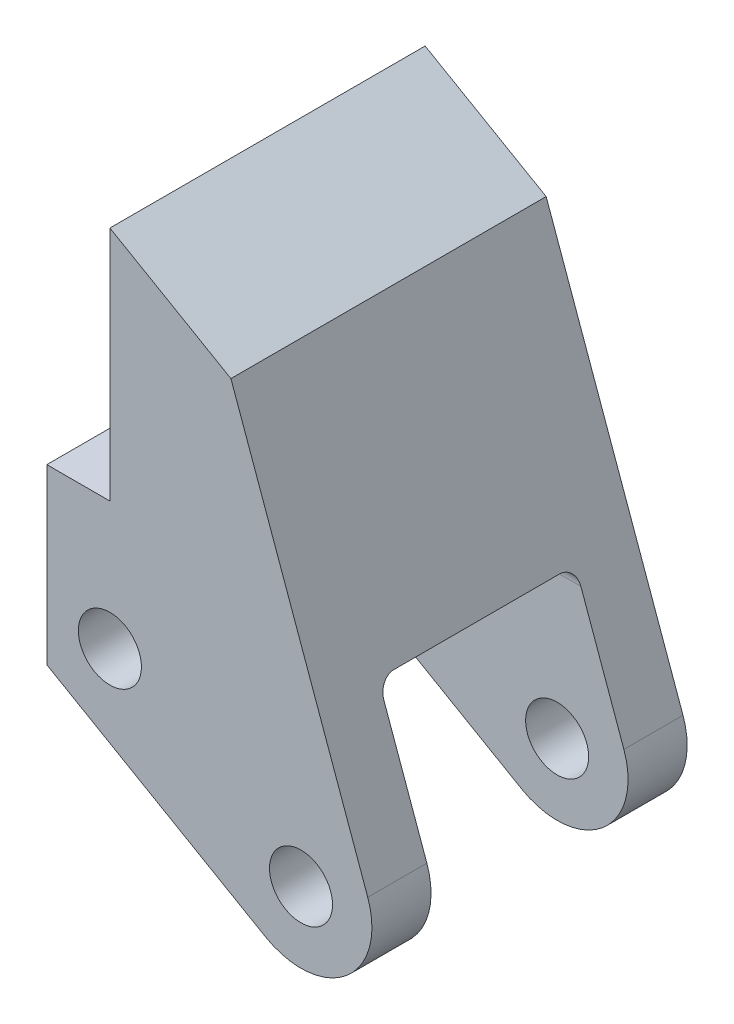
ISO-10303-21;
HEADER;
FILE_DESCRIPTION(('STEP AP214'),'2;1');
FILE_NAME('part.step','',(''),(''),'','','');
FILE_SCHEMA(('AUTOMOTIVE_DESIGN { 1 0 10303 214 1 1 1 1 }'));
ENDSEC;
DATA;
#1=APPLICATION_CONTEXT('core data for automotive mechanical design processes');
#2=APPLICATION_PROTOCOL_DEFINITION('international standard','automotive_design',2000,#1);
#3=PRODUCT_CONTEXT('',#1,'mechanical');
#4=PRODUCT('Part','Part','',(#3));
#5=PRODUCT_RELATED_PRODUCT_CATEGORY('part','',(#4));
#6=PRODUCT_DEFINITION_FORMATION('','',#4);
#7=PRODUCT_DEFINITION_CONTEXT('part definition',#1,'design');
#8=PRODUCT_DEFINITION('design','',#6,#7);
#9=PRODUCT_DEFINITION_SHAPE('','',#8);
#10=(LENGTH_UNIT() NAMED_UNIT(*) SI_UNIT(.MILLI.,.METRE.));
#11=(NAMED_UNIT(*) PLANE_ANGLE_UNIT() SI_UNIT($,.RADIAN.));
#12=(NAMED_UNIT(*) SI_UNIT($,.STERADIAN.) SOLID_ANGLE_UNIT());
#13=UNCERTAINTY_MEASURE_WITH_UNIT(LENGTH_MEASURE(1.E-05),#10,'distance_accuracy_value','');
#14=(GEOMETRIC_REPRESENTATION_CONTEXT(3) GLOBAL_UNCERTAINTY_ASSIGNED_CONTEXT((#13)) GLOBAL_UNIT_ASSIGNED_CONTEXT((#10,
#11,#12)) REPRESENTATION_CONTEXT('',''));
#15=CARTESIAN_POINT('',(0.,0.,0.));
#16=DIRECTION('',(0.,0.,1.));
#17=DIRECTION('',(1.,0.,0.));
#18=AXIS2_PLACEMENT_3D('',#15,#16,#17);
#19=CARTESIAN_POINT('',(-7.99999999999999,-5.77350269189626,40.));
#20=DIRECTION('',(0.500000000000001,0.866025403784438,0.));
#21=DIRECTION('',(-0.866025403784438,0.500000000000001,0.));
#22=AXIS2_PLACEMENT_3D('',#19,#20,#21);
#23=PLANE('',#22);
#24=DIRECTION('',(0.,0.,-1.));
#25=VECTOR('',#24,1.);
#26=CARTESIAN_POINT('',(19.7487113059643,-21.79422863406,40.));
#27=LINE('',#26,#25);
#28=CARTESIAN_POINT('',(19.7487113059643,-21.79422863406,7.5));
#29=VERTEX_POINT('',#28);
#30=CARTESIAN_POINT('',(19.7487113059643,-21.79422863406,0.));
#31=VERTEX_POINT('',#30);
#32=EDGE_CURVE('E256',#29,#31,#27,.T.);
#33=ORIENTED_EDGE('',*,*,#32,.F.);
#34=DIRECTION('',(-0.866025403784438,0.500000000000001,0.));
#35=VECTOR('',#34,1.);
#36=CARTESIAN_POINT('',(-7.99999999999999,-5.77350269189626,7.5));
#37=LINE('',#36,#35);
#38=CARTESIAN_POINT('',(-7.99999999999999,-5.77350269189625,7.5));
#39=VERTEX_POINT('',#38);
#40=EDGE_CURVE('E372',#29,#39,#37,.T.);
#41=ORIENTED_EDGE('',*,*,#40,.T.);
#42=DIRECTION('',(0.,0.,-1.));
#43=VECTOR('',#42,1.);
#44=CARTESIAN_POINT('',(-7.99999999999999,-5.77350269189626,40.));
#45=LINE('',#44,#43);
#46=CARTESIAN_POINT('',(-7.99999999999999,-5.77350269189626,0.));
#47=VERTEX_POINT('',#46);
#48=EDGE_CURVE('E175',#39,#47,#45,.T.);
#49=ORIENTED_EDGE('',*,*,#48,.T.);
#50=DIRECTION('',(0.866025403784438,-0.500000000000001,0.));
#51=VECTOR('',#50,1.);
#52=CARTESIAN_POINT('',(-7.99999999999999,-5.77350269189626,0.));
#53=LINE('',#52,#51);
#54=EDGE_CURVE('E320',#47,#31,#53,.T.);
#55=ORIENTED_EDGE('',*,*,#54,.T.);
#56=EDGE_LOOP('',(#33,#41,#49,#55));
#57=FACE_BOUND('',#56,.T.);
#58=ADVANCED_FACE('F50',(#57),#23,.F.);
#59=CARTESIAN_POINT('',(24.2487113059643,-14.,40.));
#60=DIRECTION('',(0.,0.,-1.));
#61=DIRECTION('',(-1.,0.,0.));
#62=AXIS2_PLACEMENT_3D('',#59,#60,#61);
#63=CYLINDRICAL_SURFACE('',#62,9.);
#64=CARTESIAN_POINT('',(24.2487113059643,-14.,32.5));
#65=DIRECTION('',(0.,0.,1.));
#66=DIRECTION('',(1.,0.,0.));
#67=AXIS2_PLACEMENT_3D('',#64,#65,#66);
#68=CIRCLE('',#67,9.);
#69=CARTESIAN_POINT('',(19.7487113059643,-21.79422863406,32.5));
#70=VERTEX_POINT('',#69);
#71=CARTESIAN_POINT('',(32.7184895794116,-10.9565059555439,32.5));
#72=VERTEX_POINT('',#71);
#73=EDGE_CURVE('E153',#70,#72,#68,.T.);
#74=ORIENTED_EDGE('',*,*,#73,.T.);
#75=DIRECTION('',(0.,0.,-1.));
#76=VECTOR('',#75,1.);
#77=CARTESIAN_POINT('',(32.7184895794116,-10.9565059555439,40.));
#78=LINE('',#77,#76);
#79=CARTESIAN_POINT('',(32.7184895794116,-10.9565059555439,40.));
#80=VERTEX_POINT('',#79);
#81=EDGE_CURVE('E260',#80,#72,#78,.T.);
#82=ORIENTED_EDGE('',*,*,#81,.F.);
#83=CARTESIAN_POINT('',(24.2487113059643,-14.,40.));
#84=DIRECTION('',(0.,0.,1.));
#85=DIRECTION('',(1.,0.,0.));
#86=AXIS2_PLACEMENT_3D('',#83,#84,#85);
#87=CIRCLE('',#86,9.);
#88=CARTESIAN_POINT('',(19.7487113059643,-21.79422863406,40.));
#89=VERTEX_POINT('',#88);
#90=EDGE_CURVE('E279',#89,#80,#87,.T.);
#91=ORIENTED_EDGE('',*,*,#90,.F.);
#92=EDGE_CURVE('E183',#89,#70,#27,.T.);
#93=ORIENTED_EDGE('',*,*,#92,.T.);
#94=EDGE_LOOP('',(#74,#82,#91,#93));
#95=FACE_BOUND('',#94,.T.);
#96=ADVANCED_FACE('F463',(#95),#63,.T.);
#97=CARTESIAN_POINT('',(0.,0.,40.));
#98=DIRECTION('',(0.,0.,-1.));
#99=DIRECTION('',(-1.,0.,0.));
#100=AXIS2_PLACEMENT_3D('',#97,#98,#99);
#101=CYLINDRICAL_SURFACE('',#100,4.);
#102=CARTESIAN_POINT('',(0.,0.,7.5));
#103=DIRECTION('',(0.,0.,-1.));
#104=DIRECTION('',(-1.,0.,0.));
#105=AXIS2_PLACEMENT_3D('',#102,#103,#104);
#106=CIRCLE('',#105,4.);
#107=CARTESIAN_POINT('',(-4.,0.,7.5));
#108=VERTEX_POINT('',#107);
#109=EDGE_CURVE('E203',#108,#108,#106,.T.);
#110=ORIENTED_EDGE('',*,*,#109,.F.);
#111=EDGE_LOOP('',(#110));
#112=FACE_BOUND('',#111,.T.);
#113=CARTESIAN_POINT('',(0.,0.,0.));
#114=DIRECTION('',(0.,0.,1.));
#115=DIRECTION('',(1.,0.,0.));
#116=AXIS2_PLACEMENT_3D('',#113,#114,#115);
#117=CIRCLE('',#116,4.);
#118=CARTESIAN_POINT('',(4.,0.,0.));
#119=VERTEX_POINT('',#118);
#120=EDGE_CURVE('E354',#119,#119,#117,.T.);
#121=ORIENTED_EDGE('',*,*,#120,.F.);
#122=EDGE_LOOP('',(#121));
#123=FACE_BOUND('',#122,.T.);
#124=ADVANCED_FACE('F490',(#112,#123),#101,.F.);
#125=CARTESIAN_POINT('',(24.2487113059643,-14.,40.));
#126=DIRECTION('',(0.,0.,-1.));
#127=DIRECTION('',(-1.,0.,0.));
#128=AXIS2_PLACEMENT_3D('',#125,#126,#127);
#129=CYLINDRICAL_SURFACE('',#128,4.);
#130=CARTESIAN_POINT('',(24.2487113059643,-14.,7.5));
#131=DIRECTION('',(0.,0.,-1.));
#132=DIRECTION('',(-1.,0.,0.));
#133=AXIS2_PLACEMENT_3D('',#130,#131,#132);
#134=CIRCLE('',#133,4.);
#135=CARTESIAN_POINT('',(20.2487113059643,-14.,7.5));
#136=VERTEX_POINT('',#135);
#137=EDGE_CURVE('E159',#136,#136,#134,.T.);
#138=ORIENTED_EDGE('',*,*,#137,.F.);
#139=EDGE_LOOP('',(#138));
#140=FACE_BOUND('',#139,.T.);
#141=CARTESIAN_POINT('',(24.2487113059643,-14.,0.));
#142=DIRECTION('',(0.,0.,1.));
#143=DIRECTION('',(1.,0.,0.));
#144=AXIS2_PLACEMENT_3D('',#141,#142,#143);
#145=CIRCLE('',#144,4.);
#146=CARTESIAN_POINT('',(28.2487113059643,-14.,0.));
#147=VERTEX_POINT('',#146);
#148=EDGE_CURVE('E366',#147,#147,#145,.T.);
#149=ORIENTED_EDGE('',*,*,#148,.F.);
#150=EDGE_LOOP('',(#149));
#151=FACE_BOUND('',#150,.T.);
#152=ADVANCED_FACE('F528',(#140,#151),#129,.F.);
#153=CARTESIAN_POINT('',(24.2487113059643,-14.,40.));
#154=DIRECTION('',(0.,0.,1.));
#155=DIRECTION('',(1.,0.,0.));
#156=AXIS2_PLACEMENT_3D('',#153,#154,#155);
#157=PLANE('',#156);
#158=CARTESIAN_POINT('',(0.,0.,40.));
#159=DIRECTION('',(0.,0.,1.));
#160=DIRECTION('',(1.,0.,0.));
#161=AXIS2_PLACEMENT_3D('',#158,#159,#160);
#162=CIRCLE('',#161,4.);
#163=CARTESIAN_POINT('',(4.,0.,40.));
#164=VERTEX_POINT('',#163);
#165=EDGE_CURVE('E348',#164,#164,#162,.T.);
#166=ORIENTED_EDGE('',*,*,#165,.F.);
#167=EDGE_LOOP('',(#166));
#168=FACE_BOUND('',#167,.T.);
#169=DIRECTION('',(-0.866025403784438,0.500000000000001,0.));
#170=VECTOR('',#169,1.);
#171=CARTESIAN_POINT('',(15.3564898884252,37.3604237372137,40.));
#172=LINE('',#171,#170);
#173=CARTESIAN_POINT('',(15.3564898884252,37.3604237372137,40.));
#174=VERTEX_POINT('',#173);
#175=CARTESIAN_POINT('',(0.,46.2264973081037,40.));
#176=VERTEX_POINT('',#175);
#177=EDGE_CURVE('E303',#174,#176,#172,.T.);
#178=ORIENTED_EDGE('',*,*,#177,.T.);
#179=DIRECTION('',(0.,-1.,0.));
#180=VECTOR('',#179,1.);
#181=CARTESIAN_POINT('',(0.,46.2264973081037,40.));
#182=LINE('',#181,#180);
#183=CARTESIAN_POINT('',(0.,16.2264973081037,40.));
#184=VERTEX_POINT('',#183);
#185=EDGE_CURVE('E298',#176,#184,#182,.T.);
#186=ORIENTED_EDGE('',*,*,#185,.T.);
#187=DIRECTION('',(-1.,0.,0.));
#188=VECTOR('',#187,1.);
#189=CARTESIAN_POINT('',(0.,16.2264973081037,40.));
#190=LINE('',#189,#188);
#191=CARTESIAN_POINT('',(-8.,16.2264973081037,40.));
#192=VERTEX_POINT('',#191);
#193=EDGE_CURVE('E293',#184,#192,#190,.T.);
#194=ORIENTED_EDGE('',*,*,#193,.T.);
#195=DIRECTION('',(0.,-1.,0.));
#196=VECTOR('',#195,1.);
#197=CARTESIAN_POINT('',(-8.,16.2264973081037,40.));
#198=LINE('',#197,#196);
#199=CARTESIAN_POINT('',(-7.99999999999999,-5.77350269189626,40.));
#200=VERTEX_POINT('',#199);
#201=EDGE_CURVE('E288',#192,#200,#198,.T.);
#202=ORIENTED_EDGE('',*,*,#201,.T.);
#203=DIRECTION('',(0.866025403784438,-0.500000000000001,0.));
#204=VECTOR('',#203,1.);
#205=CARTESIAN_POINT('',(-7.99999999999999,-5.77350269189626,40.));
#206=LINE('',#205,#204);
#207=EDGE_CURVE('E172',#200,#89,#206,.T.);
#208=ORIENTED_EDGE('',*,*,#207,.T.);
#209=ORIENTED_EDGE('',*,*,#90,.T.);
#210=DIRECTION('',(-0.338166004939575,0.941086474827477,0.));
#211=VECTOR('',#210,1.);
#212=CARTESIAN_POINT('',(32.7184895794116,-10.9565059555439,40.));
#213=LINE('',#212,#211);
#214=EDGE_CURVE('E274',#80,#174,#213,.T.);
#215=ORIENTED_EDGE('',*,*,#214,.T.);
#216=EDGE_LOOP('',(#178,#186,#194,#202,#208,#209,#215));
#217=FACE_BOUND('',#216,.T.);
#218=CARTESIAN_POINT('',(24.2487113059643,-14.,40.));
#219=DIRECTION('',(0.,0.,1.));
#220=DIRECTION('',(1.,0.,0.));
#221=AXIS2_PLACEMENT_3D('',#218,#219,#220);
#222=CIRCLE('',#221,4.);
#223=CARTESIAN_POINT('',(28.2487113059643,-14.,40.));
#224=VERTEX_POINT('',#223);
#225=EDGE_CURVE('E360',#224,#224,#222,.T.);
#226=ORIENTED_EDGE('',*,*,#225,.F.);
#227=EDGE_LOOP('',(#226));
#228=FACE_BOUND('',#227,.T.);
#229=ADVANCED_FACE('F465',(#168,#217,#228),#157,.T.);
#230=CARTESIAN_POINT('',(24.2487113059643,-14.,0.));
#231=DIRECTION('',(0.,0.,1.));
#232=DIRECTION('',(1.,0.,0.));
#233=AXIS2_PLACEMENT_3D('',#230,#231,#232);
#234=PLANE('',#233);
#235=DIRECTION('',(-0.866025403784438,0.500000000000001,0.));
#236=VECTOR('',#235,1.);
#237=CARTESIAN_POINT('',(15.3564898884252,37.3604237372137,0.));
#238=LINE('',#237,#236);
#239=CARTESIAN_POINT('',(15.3564898884252,37.3604237372137,0.));
#240=VERTEX_POINT('',#239);
#241=CARTESIAN_POINT('',(0.,46.2264973081037,0.));
#242=VERTEX_POINT('',#241);
#243=EDGE_CURVE('E342',#240,#242,#238,.T.);
#244=ORIENTED_EDGE('',*,*,#243,.F.);
#245=DIRECTION('',(-0.338166004939575,0.941086474827477,0.));
#246=VECTOR('',#245,1.);
#247=CARTESIAN_POINT('',(32.7184895794116,-10.9565059555439,0.));
#248=LINE('',#247,#246);
#249=CARTESIAN_POINT('',(32.7184895794116,-10.9565059555439,0.));
#250=VERTEX_POINT('',#249);
#251=EDGE_CURVE('E309',#250,#240,#248,.T.);
#252=ORIENTED_EDGE('',*,*,#251,.F.);
#253=CARTESIAN_POINT('',(24.2487113059643,-14.,0.));
#254=DIRECTION('',(0.,0.,1.));
#255=DIRECTION('',(1.,0.,0.));
#256=AXIS2_PLACEMENT_3D('',#253,#254,#255);
#257=CIRCLE('',#256,9.);
#258=EDGE_CURVE('E314',#31,#250,#257,.T.);
#259=ORIENTED_EDGE('',*,*,#258,.F.);
#260=ORIENTED_EDGE('',*,*,#54,.F.);
#261=DIRECTION('',(0.,-1.,0.));
#262=VECTOR('',#261,1.);
#263=CARTESIAN_POINT('',(-8.,16.2264973081037,0.));
#264=LINE('',#263,#262);
#265=CARTESIAN_POINT('',(-8.,16.2264973081037,0.));
#266=VERTEX_POINT('',#265);
#267=EDGE_CURVE('E326',#266,#47,#264,.T.);
#268=ORIENTED_EDGE('',*,*,#267,.F.);
#269=DIRECTION('',(-1.,0.,0.));
#270=VECTOR('',#269,1.);
#271=CARTESIAN_POINT('',(0.,16.2264973081037,0.));
#272=LINE('',#271,#270);
#273=CARTESIAN_POINT('',(0.,16.2264973081037,0.));
#274=VERTEX_POINT('',#273);
#275=EDGE_CURVE('E332',#274,#266,#272,.T.);
#276=ORIENTED_EDGE('',*,*,#275,.F.);
#277=DIRECTION('',(0.,-1.,0.));
#278=VECTOR('',#277,1.);
#279=CARTESIAN_POINT('',(0.,46.2264973081037,0.));
#280=LINE('',#279,#278);
#281=EDGE_CURVE('E337',#242,#274,#280,.T.);
#282=ORIENTED_EDGE('',*,*,#281,.F.);
#283=EDGE_LOOP('',(#244,#252,#259,#260,#268,#276,#282));
#284=FACE_BOUND('',#283,.T.);
#285=ORIENTED_EDGE('',*,*,#120,.T.);
#286=EDGE_LOOP('',(#285));
#287=FACE_BOUND('',#286,.T.);
#288=ORIENTED_EDGE('',*,*,#148,.T.);
#289=EDGE_LOOP('',(#288));
#290=FACE_BOUND('',#289,.T.);
#291=ADVANCED_FACE('F440',(#284,#287,#290),#234,.F.);
#292=CARTESIAN_POINT('',(15.3564898884252,37.3604237372137,40.));
#293=DIRECTION('',(-0.500000000000001,-0.866025403784438,0.));
#294=DIRECTION('',(0.866025403784438,-0.500000000000001,0.));
#295=AXIS2_PLACEMENT_3D('',#292,#293,#294);
#296=PLANE('',#295);
#297=ORIENTED_EDGE('',*,*,#243,.T.);
#298=DIRECTION('',(0.,0.,-1.));
#299=VECTOR('',#298,1.);
#300=CARTESIAN_POINT('',(0.,46.2264973081037,40.));
#301=LINE('',#300,#299);
#302=EDGE_CURVE('E190',#176,#242,#301,.T.);
#303=ORIENTED_EDGE('',*,*,#302,.F.);
#304=ORIENTED_EDGE('',*,*,#177,.F.);
#305=DIRECTION('',(0.,0.,-1.));
#306=VECTOR('',#305,1.);
#307=CARTESIAN_POINT('',(15.3564898884252,37.3604237372137,40.));
#308=LINE('',#307,#306);
#309=EDGE_CURVE('E269',#174,#240,#308,.T.);
#310=ORIENTED_EDGE('',*,*,#309,.T.);
#311=EDGE_LOOP('',(#297,#303,#304,#310));
#312=FACE_BOUND('',#311,.T.);
#313=ADVANCED_FACE('F476',(#312),#296,.F.);
#314=CARTESIAN_POINT('',(0.,46.2264973081037,40.));
#315=DIRECTION('',(1.,0.,0.));
#316=DIRECTION('',(0.,1.,0.));
#317=AXIS2_PLACEMENT_3D('',#314,#315,#316);
#318=PLANE('',#317);
#319=ORIENTED_EDGE('',*,*,#281,.T.);
#320=DIRECTION('',(0.,0.,-1.));
#321=VECTOR('',#320,1.);
#322=CARTESIAN_POINT('',(0.,16.2264973081037,40.));
#323=LINE('',#322,#321);
#324=EDGE_CURVE('E181',#184,#274,#323,.T.);
#325=ORIENTED_EDGE('',*,*,#324,.F.);
#326=ORIENTED_EDGE('',*,*,#185,.F.);
#327=ORIENTED_EDGE('',*,*,#302,.T.);
#328=EDGE_LOOP('',(#319,#325,#326,#327));
#329=FACE_BOUND('',#328,.T.);
#330=ADVANCED_FACE('F473',(#329),#318,.F.);
#331=CARTESIAN_POINT('',(0.,16.2264973081037,40.));
#332=DIRECTION('',(0.,-1.,0.));
#333=DIRECTION('',(0.,0.,-1.));
#334=AXIS2_PLACEMENT_3D('',#331,#332,#333);
#335=PLANE('',#334);
#336=ORIENTED_EDGE('',*,*,#275,.T.);
#337=DIRECTION('',(0.,0.,-1.));
#338=VECTOR('',#337,1.);
#339=CARTESIAN_POINT('',(-8.,16.2264973081037,40.));
#340=LINE('',#339,#338);
#341=EDGE_CURVE('E174',#192,#266,#340,.T.);
#342=ORIENTED_EDGE('',*,*,#341,.F.);
#343=ORIENTED_EDGE('',*,*,#193,.F.);
#344=ORIENTED_EDGE('',*,*,#324,.T.);
#345=EDGE_LOOP('',(#336,#342,#343,#344));
#346=FACE_BOUND('',#345,.T.);
#347=ADVANCED_FACE('F470',(#346),#335,.F.);
#348=CARTESIAN_POINT('',(-8.,16.2264973081037,40.));
#349=DIRECTION('',(1.,0.,0.));
#350=DIRECTION('',(0.,1.,0.));
#351=AXIS2_PLACEMENT_3D('',#348,#349,#350);
#352=PLANE('',#351);
#353=ORIENTED_EDGE('',*,*,#48,.F.);
#354=DIRECTION('',(0.,-1.,0.));
#355=VECTOR('',#354,1.);
#356=CARTESIAN_POINT('',(-8.,6.22649730810374,7.5));
#357=LINE('',#356,#355);
#358=CARTESIAN_POINT('',(-8.,4.22649730810374,7.5));
#359=VERTEX_POINT('',#358);
#360=EDGE_CURVE('E169',#359,#39,#357,.T.);
#361=ORIENTED_EDGE('',*,*,#360,.F.);
#362=CARTESIAN_POINT('',(-7.99999999999999,4.22649730810374,9.5));
#363=DIRECTION('',(1.,0.,0.));
#364=DIRECTION('',(0.,1.,0.));
#365=AXIS2_PLACEMENT_3D('',#362,#363,#364);
#366=CIRCLE('',#365,2.);
#367=CARTESIAN_POINT('',(-8.,6.22649730810374,9.5));
#368=VERTEX_POINT('',#367);
#369=EDGE_CURVE('E220',#359,#368,#366,.T.);
#370=ORIENTED_EDGE('',*,*,#369,.T.);
#371=DIRECTION('',(0.,0.,-1.));
#372=VECTOR('',#371,1.);
#373=CARTESIAN_POINT('',(-8.,6.22649730810374,7.5));
#374=LINE('',#373,#372);
#375=CARTESIAN_POINT('',(-8.,6.22649730810374,30.5));
#376=VERTEX_POINT('',#375);
#377=EDGE_CURVE('E168',#376,#368,#374,.T.);
#378=ORIENTED_EDGE('',*,*,#377,.F.);
#379=CARTESIAN_POINT('',(-7.99999999999999,4.22649730810374,30.5));
#380=DIRECTION('',(1.,0.,0.));
#381=DIRECTION('',(0.,1.,0.));
#382=AXIS2_PLACEMENT_3D('',#379,#380,#381);
#383=CIRCLE('',#382,2.);
#384=CARTESIAN_POINT('',(-8.,4.22649730810374,32.5));
#385=VERTEX_POINT('',#384);
#386=EDGE_CURVE('E59',#376,#385,#383,.T.);
#387=ORIENTED_EDGE('',*,*,#386,.T.);
#388=DIRECTION('',(0.,1.,0.));
#389=VECTOR('',#388,1.);
#390=CARTESIAN_POINT('',(-7.99999999999999,-24.8122986909757,32.5));
#391=LINE('',#390,#389);
#392=CARTESIAN_POINT('',(-7.99999999999999,-5.77350269189626,32.5));
#393=VERTEX_POINT('',#392);
#394=EDGE_CURVE('E152',#393,#385,#391,.T.);
#395=ORIENTED_EDGE('',*,*,#394,.F.);
#396=EDGE_CURVE('E165',#200,#393,#45,.T.);
#397=ORIENTED_EDGE('',*,*,#396,.F.);
#398=ORIENTED_EDGE('',*,*,#201,.F.);
#399=ORIENTED_EDGE('',*,*,#341,.T.);
#400=ORIENTED_EDGE('',*,*,#267,.T.);
#401=EDGE_LOOP('',(#353,#361,#370,#378,#387,#395,#397,#398,#399,#400));
#402=FACE_BOUND('',#401,.T.);
#403=ADVANCED_FACE('F163',(#402),#352,.F.);
#404=ORIENTED_EDGE('',*,*,#396,.T.);
#405=DIRECTION('',(0.866025403784438,-0.500000000000001,0.));
#406=VECTOR('',#405,1.);
#407=CARTESIAN_POINT('',(-7.99999999999999,-5.77350269189626,32.5));
#408=LINE('',#407,#406);
#409=EDGE_CURVE('E150',#393,#70,#408,.T.);
#410=ORIENTED_EDGE('',*,*,#409,.T.);
#411=ORIENTED_EDGE('',*,*,#92,.F.);
#412=ORIENTED_EDGE('',*,*,#207,.F.);
#413=EDGE_LOOP('',(#404,#410,#411,#412));
#414=FACE_BOUND('',#413,.T.);
#415=ADVANCED_FACE('F171',(#414),#23,.F.);
#416=CARTESIAN_POINT('',(32.7184895794116,-10.9565059555439,7.5));
#417=VERTEX_POINT('',#416);
#418=EDGE_CURVE('E265',#417,#250,#78,.T.);
#419=ORIENTED_EDGE('',*,*,#418,.F.);
#420=CARTESIAN_POINT('',(24.2487113059643,-14.,7.5));
#421=DIRECTION('',(0.,0.,-1.));
#422=DIRECTION('',(-1.,0.,0.));
#423=AXIS2_PLACEMENT_3D('',#420,#421,#422);
#424=CIRCLE('',#423,9.);
#425=EDGE_CURVE('E378',#417,#29,#424,.T.);
#426=ORIENTED_EDGE('',*,*,#425,.T.);
#427=ORIENTED_EDGE('',*,*,#32,.T.);
#428=ORIENTED_EDGE('',*,*,#258,.T.);
#429=EDGE_LOOP('',(#419,#426,#427,#428));
#430=FACE_BOUND('',#429,.T.);
#431=ADVANCED_FACE('F445',(#430),#63,.T.);
#432=CARTESIAN_POINT('',(32.7184895794116,-10.9565059555439,40.));
#433=DIRECTION('',(-0.941086474827477,-0.338166004939575,0.));
#434=DIRECTION('',(0.338166004939575,-0.941086474827477,0.));
#435=AXIS2_PLACEMENT_3D('',#432,#433,#434);
#436=PLANE('',#435);
#437=DIRECTION('',(-0.338166004939575,0.941086474827477,0.));
#438=VECTOR('',#437,1.);
#439=CARTESIAN_POINT('',(32.7184895794116,-10.9565059555439,32.5));
#440=LINE('',#439,#438);
#441=CARTESIAN_POINT('',(27.2626938645773,4.22649730810375,32.5));
#442=VERTEX_POINT('',#441);
#443=EDGE_CURVE('E402',#72,#442,#440,.T.);
#444=ORIENTED_EDGE('',*,*,#443,.T.);
#445=CARTESIAN_POINT('',(27.2626938645773,4.22649730810375,30.5));
#446=DIRECTION('',(-0.941086474827477,-0.338166004939575,0.));
#447=DIRECTION('',(0.338166004939575,-0.941086474827477,0.));
#448=AXIS2_PLACEMENT_3D('',#445,#446,#447);
#449=ELLIPSE('',#448,2.12520321298491,2.);
#450=CARTESIAN_POINT('',(26.5440223843574,6.22649730810375,30.5));
#451=VERTEX_POINT('',#450);
#452=EDGE_CURVE('E11',#442,#451,#449,.T.);
#453=ORIENTED_EDGE('',*,*,#452,.T.);
#454=DIRECTION('',(0.,0.,-1.));
#455=VECTOR('',#454,1.);
#456=CARTESIAN_POINT('',(26.5440223843574,6.22649730810375,40.));
#457=LINE('',#456,#455);
#458=CARTESIAN_POINT('',(26.5440223843574,6.22649730810375,9.5));
#459=VERTEX_POINT('',#458);
#460=EDGE_CURVE('E194',#451,#459,#457,.T.);
#461=ORIENTED_EDGE('',*,*,#460,.T.);
#462=CARTESIAN_POINT('',(27.2626938645773,4.22649730810375,9.5));
#463=DIRECTION('',(-0.941086474827477,-0.338166004939575,0.));
#464=DIRECTION('',(0.338166004939575,-0.941086474827477,0.));
#465=AXIS2_PLACEMENT_3D('',#462,#463,#464);
#466=ELLIPSE('',#465,2.12520321298491,2.);
#467=CARTESIAN_POINT('',(27.2626938645773,4.22649730810375,7.5));
#468=VERTEX_POINT('',#467);
#469=EDGE_CURVE('E223',#459,#468,#466,.T.);
#470=ORIENTED_EDGE('',*,*,#469,.T.);
#471=DIRECTION('',(0.338166004939575,-0.941086474827477,0.));
#472=VECTOR('',#471,1.);
#473=CARTESIAN_POINT('',(32.7184895794116,-10.9565059555439,7.5));
#474=LINE('',#473,#472);
#475=EDGE_CURVE('E384',#468,#417,#474,.T.);
#476=ORIENTED_EDGE('',*,*,#475,.T.);
#477=ORIENTED_EDGE('',*,*,#418,.T.);
#478=ORIENTED_EDGE('',*,*,#251,.T.);
#479=ORIENTED_EDGE('',*,*,#309,.F.);
#480=ORIENTED_EDGE('',*,*,#214,.F.);
#481=ORIENTED_EDGE('',*,*,#81,.T.);
#482=EDGE_LOOP('',(#444,#453,#461,#470,#476,#477,#478,#479,#480,#481));
#483=FACE_BOUND('',#482,.T.);
#484=ADVANCED_FACE('F457',(#483),#436,.F.);
#485=CARTESIAN_POINT('',(0.,0.,32.5));
#486=DIRECTION('',(0.,0.,1.));
#487=DIRECTION('',(1.,0.,0.));
#488=AXIS2_PLACEMENT_3D('',#485,#486,#487);
#489=CIRCLE('',#488,4.);
#490=CARTESIAN_POINT('',(4.,0.,32.5));
#491=VERTEX_POINT('',#490);
#492=EDGE_CURVE('E199',#491,#491,#489,.T.);
#493=ORIENTED_EDGE('',*,*,#492,.F.);
#494=EDGE_LOOP('',(#493));
#495=FACE_BOUND('',#494,.T.);
#496=ORIENTED_EDGE('',*,*,#165,.T.);
#497=EDGE_LOOP('',(#496));
#498=FACE_BOUND('',#497,.T.);
#499=ADVANCED_FACE('F557',(#495,#498),#101,.F.);
#500=CARTESIAN_POINT('',(24.2487113059643,-14.,32.5));
#501=DIRECTION('',(0.,0.,1.));
#502=DIRECTION('',(1.,0.,0.));
#503=AXIS2_PLACEMENT_3D('',#500,#501,#502);
#504=CIRCLE('',#503,4.);
#505=CARTESIAN_POINT('',(28.2487113059643,-14.,32.5));
#506=VERTEX_POINT('',#505);
#507=EDGE_CURVE('E195',#506,#506,#504,.T.);
#508=ORIENTED_EDGE('',*,*,#507,.F.);
#509=EDGE_LOOP('',(#508));
#510=FACE_BOUND('',#509,.T.);
#511=ORIENTED_EDGE('',*,*,#225,.T.);
#512=EDGE_LOOP('',(#511));
#513=FACE_BOUND('',#512,.T.);
#514=ADVANCED_FACE('F566',(#510,#513),#129,.F.);
#515=CARTESIAN_POINT('',(33.2487113059643,6.22649730810375,7.5));
#516=DIRECTION('',(0.,1.,0.));
#517=DIRECTION('',(-1.,0.,0.));
#518=AXIS2_PLACEMENT_3D('',#515,#516,#517);
#519=PLANE('',#518);
#520=ORIENTED_EDGE('',*,*,#377,.T.);
#521=DIRECTION('',(-1.,0.,0.));
#522=VECTOR('',#521,1.);
#523=CARTESIAN_POINT('',(26.5440223843574,6.22649730810375,9.5));
#524=LINE('',#523,#522);
#525=EDGE_CURVE('E215',#368,#459,#524,.F.);
#526=ORIENTED_EDGE('',*,*,#525,.T.);
#527=ORIENTED_EDGE('',*,*,#460,.F.);
#528=DIRECTION('',(-1.,0.,0.));
#529=VECTOR('',#528,1.);
#530=CARTESIAN_POINT('',(-7.99999999999999,6.22649730810374,30.5));
#531=LINE('',#530,#529);
#532=EDGE_CURVE('E211',#451,#376,#531,.T.);
#533=ORIENTED_EDGE('',*,*,#532,.T.);
#534=EDGE_LOOP('',(#520,#526,#527,#533));
#535=FACE_BOUND('',#534,.T.);
#536=ADVANCED_FACE('F452',(#535),#519,.F.);
#537=CARTESIAN_POINT('',(33.2487113059643,6.22649730810375,7.5));
#538=DIRECTION('',(0.,0.,-1.));
#539=DIRECTION('',(-1.,0.,0.));
#540=AXIS2_PLACEMENT_3D('',#537,#538,#539);
#541=PLANE('',#540);
#542=ORIENTED_EDGE('',*,*,#109,.T.);
#543=EDGE_LOOP('',(#542));
#544=FACE_BOUND('',#543,.T.);
#545=ORIENTED_EDGE('',*,*,#137,.T.);
#546=EDGE_LOOP('',(#545));
#547=FACE_BOUND('',#546,.T.);
#548=ORIENTED_EDGE('',*,*,#475,.F.);
#549=DIRECTION('',(-1.,0.,0.));
#550=VECTOR('',#549,1.);
#551=CARTESIAN_POINT('',(-7.99999999999999,4.22649730810374,7.5));
#552=LINE('',#551,#550);
#553=EDGE_CURVE('E207',#468,#359,#552,.T.);
#554=ORIENTED_EDGE('',*,*,#553,.T.);
#555=ORIENTED_EDGE('',*,*,#360,.T.);
#556=ORIENTED_EDGE('',*,*,#40,.F.);
#557=ORIENTED_EDGE('',*,*,#425,.F.);
#558=EDGE_LOOP('',(#548,#554,#555,#556,#557));
#559=FACE_BOUND('',#558,.T.);
#560=ADVANCED_FACE('F428',(#544,#547,#559),#541,.F.);
#561=CARTESIAN_POINT('',(33.2487113059643,-24.8122986909757,32.5));
#562=DIRECTION('',(0.,0.,1.));
#563=DIRECTION('',(1.,0.,0.));
#564=AXIS2_PLACEMENT_3D('',#561,#562,#563);
#565=PLANE('',#564);
#566=ORIENTED_EDGE('',*,*,#492,.T.);
#567=EDGE_LOOP('',(#566));
#568=FACE_BOUND('',#567,.T.);
#569=ORIENTED_EDGE('',*,*,#507,.T.);
#570=EDGE_LOOP('',(#569));
#571=FACE_BOUND('',#570,.T.);
#572=ORIENTED_EDGE('',*,*,#394,.T.);
#573=DIRECTION('',(-1.,0.,0.));
#574=VECTOR('',#573,1.);
#575=CARTESIAN_POINT('',(26.5440223843574,4.22649730810375,32.5));
#576=LINE('',#575,#574);
#577=EDGE_CURVE('E66',#385,#442,#576,.F.);
#578=ORIENTED_EDGE('',*,*,#577,.T.);
#579=ORIENTED_EDGE('',*,*,#443,.F.);
#580=ORIENTED_EDGE('',*,*,#73,.F.);
#581=ORIENTED_EDGE('',*,*,#409,.F.);
#582=EDGE_LOOP('',(#572,#578,#579,#580,#581));
#583=FACE_BOUND('',#582,.T.);
#584=ADVANCED_FACE('F151',(#568,#571,#583),#565,.F.);
#585=CARTESIAN_POINT('',(33.2487113059643,4.22649730810375,9.5));
#586=DIRECTION('',(1.,0.,0.));
#587=DIRECTION('',(0.,1.,0.));
#588=AXIS2_PLACEMENT_3D('',#585,#586,#587);
#589=CYLINDRICAL_SURFACE('',#588,2.);
#590=ORIENTED_EDGE('',*,*,#469,.F.);
#591=ORIENTED_EDGE('',*,*,#525,.F.);
#592=ORIENTED_EDGE('',*,*,#369,.F.);
#593=ORIENTED_EDGE('',*,*,#553,.F.);
#594=EDGE_LOOP('',(#590,#591,#592,#593));
#595=FACE_BOUND('',#594,.T.);
#596=ADVANCED_FACE('F449',(#595),#589,.F.);
#597=CARTESIAN_POINT('',(33.2487113059643,4.22649730810375,30.5));
#598=DIRECTION('',(1.,0.,0.));
#599=DIRECTION('',(0.,1.,0.));
#600=AXIS2_PLACEMENT_3D('',#597,#598,#599);
#601=CYLINDRICAL_SURFACE('',#600,2.);
#602=ORIENTED_EDGE('',*,*,#452,.F.);
#603=ORIENTED_EDGE('',*,*,#577,.F.);
#604=ORIENTED_EDGE('',*,*,#386,.F.);
#605=ORIENTED_EDGE('',*,*,#532,.F.);
#606=EDGE_LOOP('',(#602,#603,#604,#605));
#607=FACE_BOUND('',#606,.T.);
#608=ADVANCED_FACE('F52',(#607),#601,.F.);
#609=CLOSED_SHELL('',(#58,#96,#124,#152,#229,#291,#313,#330,#347,#403,#415,#431,#484,#499,#514,
#536,#560,#584,#596,#608));
#610=MANIFOLD_SOLID_BREP('B2',#609);
#611=ADVANCED_BREP_SHAPE_REPRESENTATION('',(#18,#610),#14);
#612=SHAPE_DEFINITION_REPRESENTATION(#9,#611);
ENDSEC;
END-ISO-10303-21;
